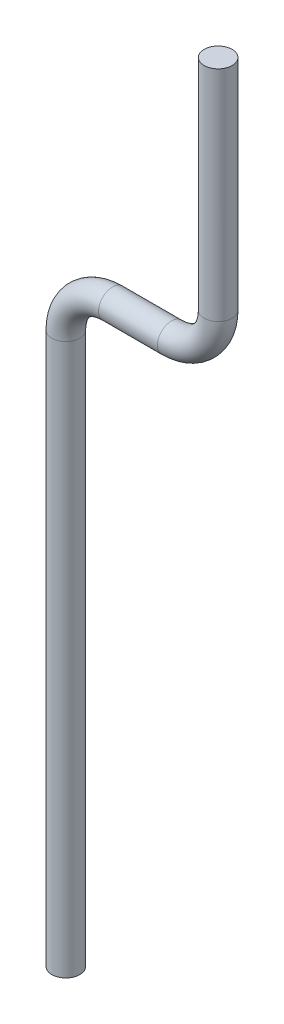
ISO-10303-21;
HEADER;
FILE_DESCRIPTION(('STEP AP214'),'2;1');
FILE_NAME('part.step','',(''),(''),'','','');
FILE_SCHEMA(('AUTOMOTIVE_DESIGN { 1 0 10303 214 1 1 1 1 }'));
ENDSEC;
DATA;
#1=APPLICATION_CONTEXT('core data for automotive mechanical design processes');
#2=APPLICATION_PROTOCOL_DEFINITION('international standard','automotive_design',2000,#1);
#3=PRODUCT_CONTEXT('',#1,'mechanical');
#4=PRODUCT('Part','Part','',(#3));
#5=PRODUCT_RELATED_PRODUCT_CATEGORY('part','',(#4));
#6=PRODUCT_DEFINITION_FORMATION('','',#4);
#7=PRODUCT_DEFINITION_CONTEXT('part definition',#1,'design');
#8=PRODUCT_DEFINITION('design','',#6,#7);
#9=PRODUCT_DEFINITION_SHAPE('','',#8);
#10=(LENGTH_UNIT() NAMED_UNIT(*) SI_UNIT(.MILLI.,.METRE.));
#11=(NAMED_UNIT(*) PLANE_ANGLE_UNIT() SI_UNIT($,.RADIAN.));
#12=(NAMED_UNIT(*) SI_UNIT($,.STERADIAN.) SOLID_ANGLE_UNIT());
#13=UNCERTAINTY_MEASURE_WITH_UNIT(LENGTH_MEASURE(1.E-05),#10,'distance_accuracy_value','');
#14=(GEOMETRIC_REPRESENTATION_CONTEXT(3) GLOBAL_UNCERTAINTY_ASSIGNED_CONTEXT((#13)) GLOBAL_UNIT_ASSIGNED_CONTEXT((#10,
#11,#12)) REPRESENTATION_CONTEXT('',''));
#15=CARTESIAN_POINT('',(0.,0.,0.));
#16=DIRECTION('',(0.,0.,1.));
#17=DIRECTION('',(1.,0.,0.));
#18=AXIS2_PLACEMENT_3D('',#15,#16,#17);
#19=CARTESIAN_POINT('',(-16.30481531006,-92.4319477279291,0.));
#20=DIRECTION('',(0.,1.,0.));
#21=DIRECTION('',(0.,0.,1.));
#22=AXIS2_PLACEMENT_3D('',#19,#20,#21);
#23=PLANE('',#22);
#24=CARTESIAN_POINT('',(-16.30481531006,-92.4319477279291,0.));
#25=DIRECTION('',(0.,1.,0.));
#26=DIRECTION('',(0.,0.,1.));
#27=AXIS2_PLACEMENT_3D('',#24,#25,#26);
#28=CIRCLE('',#27,1.5);
#29=CARTESIAN_POINT('',(-16.30481531006,-92.4319477279291,1.49999999999999));
#30=VERTEX_POINT('',#29);
#31=EDGE_CURVE('E42',#30,#30,#28,.T.);
#32=ORIENTED_EDGE('',*,*,#31,.F.);
#33=EDGE_LOOP('',(#32));
#34=FACE_BOUND('',#33,.T.);
#35=ADVANCED_FACE('F30',(#34),#23,.F.);
#36=CARTESIAN_POINT('',(0.,0.,0.));
#37=DIRECTION('',(0.,1.,0.));
#38=DIRECTION('',(0.,0.,1.));
#39=AXIS2_PLACEMENT_3D('',#36,#37,#38);
#40=PLANE('',#39);
#41=CARTESIAN_POINT('',(0.,0.,0.));
#42=DIRECTION('',(0.,1.,0.));
#43=DIRECTION('',(0.,0.,1.));
#44=AXIS2_PLACEMENT_3D('',#41,#42,#43);
#45=CIRCLE('',#44,1.5);
#46=CARTESIAN_POINT('',(0.,0.,1.5));
#47=VERTEX_POINT('',#46);
#48=EDGE_CURVE('E11',#47,#47,#45,.T.);
#49=ORIENTED_EDGE('',*,*,#48,.T.);
#50=EDGE_LOOP('',(#49));
#51=FACE_BOUND('',#50,.T.);
#52=ADVANCED_FACE('F45',(#51),#40,.T.);
#53=CARTESIAN_POINT('',(-16.30481531006,-92.4319477279291,0.));
#54=DIRECTION('',(0.,1.,0.));
#55=DIRECTION('',(0.,0.,1.));
#56=AXIS2_PLACEMENT_3D('',#53,#54,#55);
#57=CYLINDRICAL_SURFACE('',#56,1.5);
#58=CARTESIAN_POINT('',(-16.30481531006,-33.4293945800867,0.));
#59=DIRECTION('',(0.,1.,0.));
#60=DIRECTION('',(0.,0.,1.));
#61=AXIS2_PLACEMENT_3D('',#58,#59,#60);
#62=CIRCLE('',#61,1.5);
#63=CARTESIAN_POINT('',(-17.80481531006,-33.4293945800867,0.));
#64=VERTEX_POINT('',#63);
#65=EDGE_CURVE('E62',#64,#64,#62,.T.);
#66=ORIENTED_EDGE('',*,*,#65,.F.);
#67=EDGE_LOOP('',(#66));
#68=FACE_BOUND('',#67,.T.);
#69=ORIENTED_EDGE('',*,*,#31,.T.);
#70=EDGE_LOOP('',(#69));
#71=FACE_BOUND('',#70,.T.);
#72=ADVANCED_FACE('F66',(#68,#71),#57,.T.);
#73=CARTESIAN_POINT('',(-11.30481531006,-33.4293945800867,0.));
#74=DIRECTION('',(0.,0.,-1.));
#75=DIRECTION('',(-1.,0.,0.));
#76=AXIS2_PLACEMENT_3D('',#73,#74,#75);
#77=TOROIDAL_SURFACE('',#76,5.,1.5);
#78=CARTESIAN_POINT('',(-11.30481531006,-28.4293945800867,0.));
#79=DIRECTION('',(1.,0.,0.));
#80=DIRECTION('',(0.,0.,1.));
#81=AXIS2_PLACEMENT_3D('',#78,#79,#80);
#82=CIRCLE('',#81,1.5);
#83=CARTESIAN_POINT('',(-11.3048153100599,-26.9293945800867,0.));
#84=VERTEX_POINT('',#83);
#85=EDGE_CURVE('E57',#84,#84,#82,.T.);
#86=CARTESIAN_POINT('',(-11.30481531006,-33.4293945800867,0.));
#87=DIRECTION('',(0.,0.,-1.));
#88=DIRECTION('',(-1.,0.,0.));
#89=AXIS2_PLACEMENT_3D('',#86,#87,#88);
#90=CIRCLE('',#89,6.5);
#91=EDGE_CURVE('',#64,#84,#90,.T.);
#92=ORIENTED_EDGE('',*,*,#65,.T.);
#93=ORIENTED_EDGE('',*,*,#85,.F.);
#94=ORIENTED_EDGE('',*,*,#91,.T.);
#95=ORIENTED_EDGE('',*,*,#91,.F.);
#96=EDGE_LOOP('',(#92,#94,#93,#95));
#97=FACE_BOUND('',#96,.T.);
#98=ADVANCED_FACE('F68',(#97),#77,.T.);
#99=CARTESIAN_POINT('',(-11.30481531006,-28.4293945800867,0.));
#100=DIRECTION('',(1.,0.,0.));
#101=DIRECTION('',(0.,0.,-1.));
#102=AXIS2_PLACEMENT_3D('',#99,#100,#101);
#103=CYLINDRICAL_SURFACE('',#102,1.5);
#104=CARTESIAN_POINT('',(-5.00000000000003,-28.4293945800866,0.));
#105=DIRECTION('',(1.,0.,0.));
#106=DIRECTION('',(0.,0.,1.));
#107=AXIS2_PLACEMENT_3D('',#104,#105,#106);
#108=CIRCLE('',#107,1.5);
#109=CARTESIAN_POINT('',(-5.00000000000004,-29.9293945800866,0.));
#110=VERTEX_POINT('',#109);
#111=EDGE_CURVE('E55',#110,#110,#108,.T.);
#112=ORIENTED_EDGE('',*,*,#111,.F.);
#113=EDGE_LOOP('',(#112));
#114=FACE_BOUND('',#113,.T.);
#115=ORIENTED_EDGE('',*,*,#85,.T.);
#116=EDGE_LOOP('',(#115));
#117=FACE_BOUND('',#116,.T.);
#118=ADVANCED_FACE('F75',(#114,#117),#103,.T.);
#119=CARTESIAN_POINT('',(-5.,-23.4293945800866,0.));
#120=DIRECTION('',(0.,0.,1.));
#121=DIRECTION('',(1.,0.,0.));
#122=AXIS2_PLACEMENT_3D('',#119,#120,#121);
#123=TOROIDAL_SURFACE('',#122,5.,1.5);
#124=CARTESIAN_POINT('',(0.,-23.4293945800866,0.));
#125=DIRECTION('',(0.,1.,0.));
#126=DIRECTION('',(0.,0.,1.));
#127=AXIS2_PLACEMENT_3D('',#124,#125,#126);
#128=CIRCLE('',#127,1.5);
#129=CARTESIAN_POINT('',(1.5,-23.4293945800866,0.));
#130=VERTEX_POINT('',#129);
#131=EDGE_CURVE('E37',#130,#130,#128,.T.);
#132=CARTESIAN_POINT('',(-5.,-23.4293945800866,0.));
#133=DIRECTION('',(0.,0.,1.));
#134=DIRECTION('',(1.,0.,0.));
#135=AXIS2_PLACEMENT_3D('',#132,#133,#134);
#136=CIRCLE('',#135,6.5);
#137=EDGE_CURVE('',#110,#130,#136,.T.);
#138=ORIENTED_EDGE('',*,*,#111,.T.);
#139=ORIENTED_EDGE('',*,*,#131,.F.);
#140=ORIENTED_EDGE('',*,*,#137,.T.);
#141=ORIENTED_EDGE('',*,*,#137,.F.);
#142=EDGE_LOOP('',(#138,#140,#139,#141));
#143=FACE_BOUND('',#142,.T.);
#144=ADVANCED_FACE('F50',(#143),#123,.T.);
#145=CARTESIAN_POINT('',(0.,-23.4293945800866,0.));
#146=DIRECTION('',(0.,1.,0.));
#147=DIRECTION('',(0.,0.,1.));
#148=AXIS2_PLACEMENT_3D('',#145,#146,#147);
#149=CYLINDRICAL_SURFACE('',#148,1.5);
#150=ORIENTED_EDGE('',*,*,#48,.F.);
#151=EDGE_LOOP('',(#150));
#152=FACE_BOUND('',#151,.T.);
#153=ORIENTED_EDGE('',*,*,#131,.T.);
#154=EDGE_LOOP('',(#153));
#155=FACE_BOUND('',#154,.T.);
#156=ADVANCED_FACE('F47',(#152,#155),#149,.T.);
#157=CLOSED_SHELL('',(#35,#52,#72,#98,#118,#144,#156));
#158=MANIFOLD_SOLID_BREP('B2',#157);
#159=ADVANCED_BREP_SHAPE_REPRESENTATION('',(#18,#158),#14);
#160=SHAPE_DEFINITION_REPRESENTATION(#9,#159);
ENDSEC;
END-ISO-10303-21;
